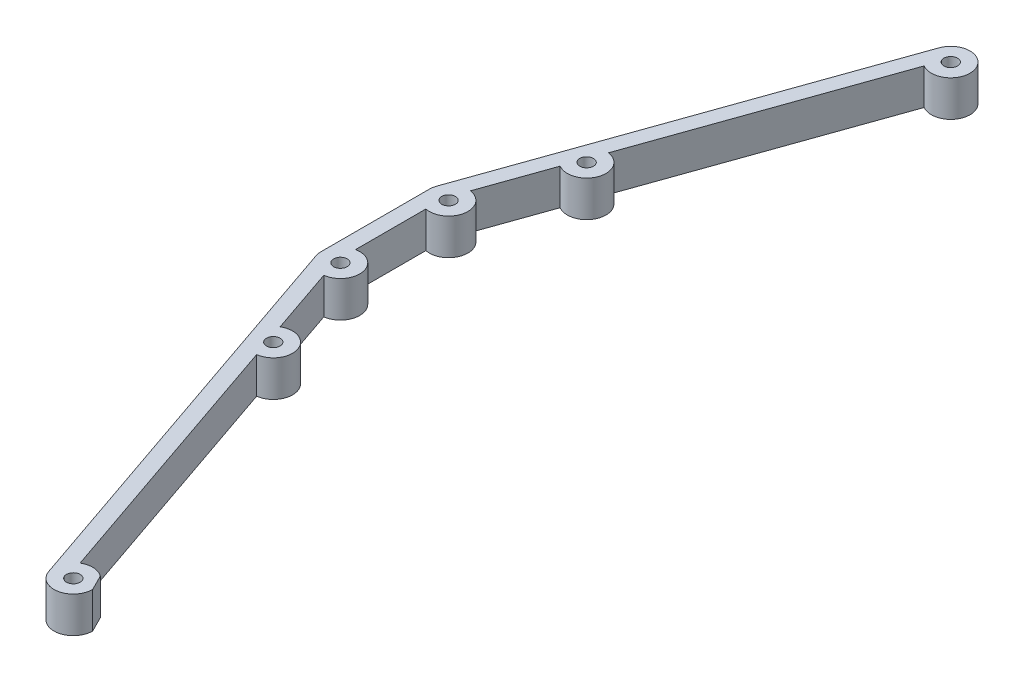
ISO-10303-21;
HEADER;
FILE_DESCRIPTION(('STEP AP214'),'2;1');
FILE_NAME('part.step','',(''),(''),'','','');
FILE_SCHEMA(('AUTOMOTIVE_DESIGN { 1 0 10303 214 1 1 1 1 }'));
ENDSEC;
DATA;
#1=APPLICATION_CONTEXT('core data for automotive mechanical design processes');
#2=APPLICATION_PROTOCOL_DEFINITION('international standard','automotive_design',2000,#1);
#3=PRODUCT_CONTEXT('',#1,'mechanical');
#4=PRODUCT('Part','Part','',(#3));
#5=PRODUCT_RELATED_PRODUCT_CATEGORY('part','',(#4));
#6=PRODUCT_DEFINITION_FORMATION('','',#4);
#7=PRODUCT_DEFINITION_CONTEXT('part definition',#1,'design');
#8=PRODUCT_DEFINITION('design','',#6,#7);
#9=PRODUCT_DEFINITION_SHAPE('','',#8);
#10=(LENGTH_UNIT() NAMED_UNIT(*) SI_UNIT(.MILLI.,.METRE.));
#11=(NAMED_UNIT(*) PLANE_ANGLE_UNIT() SI_UNIT($,.RADIAN.));
#12=(NAMED_UNIT(*) SI_UNIT($,.STERADIAN.) SOLID_ANGLE_UNIT());
#13=UNCERTAINTY_MEASURE_WITH_UNIT(LENGTH_MEASURE(1.E-05),#10,'distance_accuracy_value','');
#14=(GEOMETRIC_REPRESENTATION_CONTEXT(3) GLOBAL_UNCERTAINTY_ASSIGNED_CONTEXT((#13)) GLOBAL_UNIT_ASSIGNED_CONTEXT((#10,
#11,#12)) REPRESENTATION_CONTEXT('',''));
#15=CARTESIAN_POINT('',(0.,0.,0.));
#16=DIRECTION('',(0.,0.,1.));
#17=DIRECTION('',(1.,0.,0.));
#18=AXIS2_PLACEMENT_3D('',#15,#16,#17);
#19=CARTESIAN_POINT('',(18.1999631487136,14.,-41.2755472424004));
#20=DIRECTION('',(0.,-1.,0.));
#21=DIRECTION('',(0.,0.,-1.));
#22=AXIS2_PLACEMENT_3D('',#19,#20,#21);
#23=CYLINDRICAL_SURFACE('',#22,7.50000000000001);
#24=CARTESIAN_POINT('',(18.1999631487135,0.,-41.2755472424003));
#25=DIRECTION('',(0.,1.,0.));
#26=DIRECTION('',(0.,0.,1.));
#27=AXIS2_PLACEMENT_3D('',#24,#25,#26);
#28=CIRCLE('',#27,7.50000000000001);
#29=CARTESIAN_POINT('',(14.3327568592149,0.,-34.8494507978656));
#30=VERTEX_POINT('',#29);
#31=CARTESIAN_POINT('',(19.2392877627286,0.,-48.7031851136689));
#32=VERTEX_POINT('',#31);
#33=EDGE_CURVE('E316',#30,#32,#28,.T.);
#34=ORIENTED_EDGE('',*,*,#33,.T.);
#35=DIRECTION('',(0.,-1.,0.));
#36=VECTOR('',#35,1.);
#37=CARTESIAN_POINT('',(19.2392877627286,14.,-48.7031851136689));
#38=LINE('',#37,#36);
#39=CARTESIAN_POINT('',(19.2392877627286,14.,-48.7031851136689));
#40=VERTEX_POINT('',#39);
#41=EDGE_CURVE('E11',#40,#32,#38,.T.);
#42=ORIENTED_EDGE('',*,*,#41,.F.);
#43=CARTESIAN_POINT('',(18.1999631487136,14.,-41.2755472424004));
#44=DIRECTION('',(0.,1.,0.));
#45=DIRECTION('',(0.,0.,1.));
#46=AXIS2_PLACEMENT_3D('',#43,#44,#45);
#47=CIRCLE('',#46,7.50000000000001);
#48=CARTESIAN_POINT('',(14.3327568592149,14.,-34.8494507978657));
#49=VERTEX_POINT('',#48);
#50=EDGE_CURVE('E222',#49,#40,#47,.T.);
#51=ORIENTED_EDGE('',*,*,#50,.F.);
#52=DIRECTION('',(0.,-1.,0.));
#53=VECTOR('',#52,1.);
#54=CARTESIAN_POINT('',(14.3327568592149,14.,-34.8494507978657));
#55=LINE('',#54,#53);
#56=EDGE_CURVE('E241',#49,#30,#55,.T.);
#57=ORIENTED_EDGE('',*,*,#56,.T.);
#58=EDGE_LOOP('',(#34,#42,#51,#57));
#59=FACE_BOUND('',#58,.T.);
#60=ADVANCED_FACE('F40',(#59),#23,.T.);
#61=CARTESIAN_POINT('',(1.76842265814611,14.,0.626316358093404));
#62=DIRECTION('',(-0.942627225161207,0.,-0.333847142244594));
#63=DIRECTION('',(-0.333847142244594,0.,0.942627225161207));
#64=AXIS2_PLACEMENT_3D('',#61,#62,#63);
#65=PLANE('',#64);
#66=DIRECTION('',(0.333847142244594,0.,-0.942627225161207));
#67=VECTOR('',#66,1.);
#68=CARTESIAN_POINT('',(1.76842265814606,0.,0.626316358093404));
#69=LINE('',#68,#67);
#70=CARTESIAN_POINT('',(51.311176884942,0.,-139.259107341095));
#71=VERTEX_POINT('',#70);
#72=EDGE_CURVE('E306',#32,#71,#69,.T.);
#73=ORIENTED_EDGE('',*,*,#72,.T.);
#74=DIRECTION('',(0.,-1.,0.));
#75=VECTOR('',#74,1.);
#76=CARTESIAN_POINT('',(51.311176884942,14.,-139.259107341095));
#77=LINE('',#76,#75);
#78=CARTESIAN_POINT('',(51.311176884942,14.,-139.259107341095));
#79=VERTEX_POINT('',#78);
#80=EDGE_CURVE('E49',#79,#71,#77,.T.);
#81=ORIENTED_EDGE('',*,*,#80,.F.);
#82=DIRECTION('',(0.333847142244594,0.,-0.942627225161207));
#83=VECTOR('',#82,1.);
#84=CARTESIAN_POINT('',(1.76842265814611,14.,0.626316358093404));
#85=LINE('',#84,#83);
#86=EDGE_CURVE('E130',#40,#79,#85,.T.);
#87=ORIENTED_EDGE('',*,*,#86,.F.);
#88=ORIENTED_EDGE('',*,*,#41,.T.);
#89=EDGE_LOOP('',(#73,#81,#87,#88));
#90=FACE_BOUND('',#89,.T.);
#91=ADVANCED_FACE('F390',(#90),#65,.F.);
#92=CARTESIAN_POINT('',(55.1783831744406,14.,-145.68520378563));
#93=DIRECTION('',(0.,-1.,0.));
#94=DIRECTION('',(0.,0.,-1.));
#95=AXIS2_PLACEMENT_3D('',#92,#93,#94);
#96=CYLINDRICAL_SURFACE('',#95,7.50000000000001);
#97=CARTESIAN_POINT('',(55.1783831744406,0.,-145.68520378563));
#98=DIRECTION('',(0.,1.,0.));
#99=DIRECTION('',(0.,0.,1.));
#100=AXIS2_PLACEMENT_3D('',#97,#98,#99);
#101=CIRCLE('',#100,7.50000000000001);
#102=CARTESIAN_POINT('',(48.1086789857316,0.,-148.189057352464));
#103=VERTEX_POINT('',#102);
#104=EDGE_CURVE('E300',#71,#103,#101,.T.);
#105=ORIENTED_EDGE('',*,*,#104,.T.);
#106=DIRECTION('',(0.,-1.,0.));
#107=VECTOR('',#106,1.);
#108=CARTESIAN_POINT('',(48.1086789857316,14.,-148.189057352464));
#109=LINE('',#108,#107);
#110=CARTESIAN_POINT('',(48.1086789857316,14.,-148.189057352464));
#111=VERTEX_POINT('',#110);
#112=EDGE_CURVE('E289',#111,#103,#109,.T.);
#113=ORIENTED_EDGE('',*,*,#112,.F.);
#114=CARTESIAN_POINT('',(55.1783831744406,14.,-145.68520378563));
#115=DIRECTION('',(0.,1.,0.));
#116=DIRECTION('',(0.,0.,1.));
#117=AXIS2_PLACEMENT_3D('',#114,#115,#116);
#118=CIRCLE('',#117,7.50000000000001);
#119=EDGE_CURVE('E213',#79,#111,#118,.T.);
#120=ORIENTED_EDGE('',*,*,#119,.F.);
#121=ORIENTED_EDGE('',*,*,#80,.T.);
#122=EDGE_LOOP('',(#105,#113,#120,#121));
#123=FACE_BOUND('',#122,.T.);
#124=ADVANCED_FACE('F298',(#123),#96,.T.);
#125=CARTESIAN_POINT('',(-3.88734069282115,14.,-1.37676649537416));
#126=DIRECTION('',(0.942627225161207,0.,0.333847142244594));
#127=DIRECTION('',(0.333847142244594,0.,-0.942627225161207));
#128=AXIS2_PLACEMENT_3D('',#125,#126,#127);
#129=PLANE('',#128);
#130=DIRECTION('',(-0.333847142244594,0.,0.942627225161207));
#131=VECTOR('',#130,1.);
#132=CARTESIAN_POINT('',(-3.88734069282118,0.,-1.37676649537416));
#133=LINE('',#132,#131);
#134=CARTESIAN_POINT('',(-2.89132101426848,0.,-4.18905735246414));
#135=VERTEX_POINT('',#134);
#136=EDGE_CURVE('E308',#103,#135,#133,.T.);
#137=ORIENTED_EDGE('',*,*,#136,.T.);
#138=DIRECTION('',(0.,-1.,0.));
#139=VECTOR('',#138,1.);
#140=CARTESIAN_POINT('',(-2.89132101426848,14.,-4.18905735246411));
#141=LINE('',#140,#139);
#142=CARTESIAN_POINT('',(-2.89132101426848,14.,-4.18905735246411));
#143=VERTEX_POINT('',#142);
#144=EDGE_CURVE('E285',#143,#135,#141,.T.);
#145=ORIENTED_EDGE('',*,*,#144,.F.);
#146=DIRECTION('',(-0.333847142244594,0.,0.942627225161207));
#147=VECTOR('',#146,1.);
#148=CARTESIAN_POINT('',(-3.88734069282115,14.,-1.37676649537416));
#149=LINE('',#148,#147);
#150=EDGE_CURVE('E206',#111,#143,#149,.T.);
#151=ORIENTED_EDGE('',*,*,#150,.F.);
#152=ORIENTED_EDGE('',*,*,#112,.T.);
#153=EDGE_LOOP('',(#137,#145,#151,#152));
#154=FACE_BOUND('',#153,.T.);
#155=ADVANCED_FACE('F525',(#154),#129,.F.);
#156=CARTESIAN_POINT('',(4.17838317444061,14.,-1.68520378562964));
#157=DIRECTION('',(0.,-1.,0.));
#158=DIRECTION('',(0.,0.,-1.));
#159=AXIS2_PLACEMENT_3D('',#156,#157,#158);
#160=CYLINDRICAL_SURFACE('',#159,7.49999999999996);
#161=CARTESIAN_POINT('',(4.17838317444058,0.,-1.68520378562964));
#162=DIRECTION('',(0.,1.,0.));
#163=DIRECTION('',(0.,0.,1.));
#164=AXIS2_PLACEMENT_3D('',#161,#162,#163);
#165=CIRCLE('',#164,7.49999999999996);
#166=CARTESIAN_POINT('',(-3.3216168255594,0.,-1.68520378562964));
#167=VERTEX_POINT('',#166);
#168=EDGE_CURVE('E314',#135,#167,#165,.T.);
#169=ORIENTED_EDGE('',*,*,#168,.T.);
#170=DIRECTION('',(0.,-1.,0.));
#171=VECTOR('',#170,1.);
#172=CARTESIAN_POINT('',(-3.32161682555937,14.,-1.68520378562964));
#173=LINE('',#172,#171);
#174=CARTESIAN_POINT('',(-3.32161682555937,14.,-1.68520378562964));
#175=VERTEX_POINT('',#174);
#176=EDGE_CURVE('E281',#175,#167,#173,.T.);
#177=ORIENTED_EDGE('',*,*,#176,.F.);
#178=CARTESIAN_POINT('',(4.17838317444061,14.,-1.68520378562964));
#179=DIRECTION('',(0.,1.,0.));
#180=DIRECTION('',(0.,0.,1.));
#181=AXIS2_PLACEMENT_3D('',#178,#179,#180);
#182=CIRCLE('',#181,7.49999999999996);
#183=EDGE_CURVE('E197',#143,#175,#182,.T.);
#184=ORIENTED_EDGE('',*,*,#183,.F.);
#185=ORIENTED_EDGE('',*,*,#144,.T.);
#186=EDGE_LOOP('',(#169,#177,#184,#185));
#187=FACE_BOUND('',#186,.T.);
#188=ADVANCED_FACE('F523',(#187),#160,.T.);
#189=CARTESIAN_POINT('',(-3.32161682555943,14.,0.));
#190=DIRECTION('',(1.,0.,0.));
#191=DIRECTION('',(0.,0.,-1.));
#192=AXIS2_PLACEMENT_3D('',#189,#190,#191);
#193=PLANE('',#192);
#194=DIRECTION('',(0.,0.,1.));
#195=VECTOR('',#194,1.);
#196=CARTESIAN_POINT('',(-3.32161682555943,0.,0.));
#197=LINE('',#196,#195);
#198=CARTESIAN_POINT('',(-3.32161682555943,0.,40.3147962143704));
#199=VERTEX_POINT('',#198);
#200=EDGE_CURVE('E322',#167,#199,#197,.T.);
#201=ORIENTED_EDGE('',*,*,#200,.T.);
#202=DIRECTION('',(0.,-1.,0.));
#203=VECTOR('',#202,1.);
#204=CARTESIAN_POINT('',(-3.32161682555937,14.,40.3147962143704));
#205=LINE('',#204,#203);
#206=CARTESIAN_POINT('',(-3.32161682555937,14.,40.3147962143704));
#207=VERTEX_POINT('',#206);
#208=EDGE_CURVE('E277',#207,#199,#205,.T.);
#209=ORIENTED_EDGE('',*,*,#208,.F.);
#210=DIRECTION('',(0.,0.,1.));
#211=VECTOR('',#210,1.);
#212=CARTESIAN_POINT('',(-3.32161682555943,14.,0.));
#213=LINE('',#212,#211);
#214=EDGE_CURVE('E205',#175,#207,#213,.T.);
#215=ORIENTED_EDGE('',*,*,#214,.F.);
#216=ORIENTED_EDGE('',*,*,#176,.T.);
#217=EDGE_LOOP('',(#201,#209,#215,#216));
#218=FACE_BOUND('',#217,.T.);
#219=ADVANCED_FACE('F521',(#218),#193,.F.);
#220=CARTESIAN_POINT('',(4.17838317444061,14.,40.3147962143704));
#221=DIRECTION('',(0.,-1.,0.));
#222=DIRECTION('',(0.,0.,-1.));
#223=AXIS2_PLACEMENT_3D('',#220,#221,#222);
#224=CYLINDRICAL_SURFACE('',#223,7.49999999999999);
#225=CARTESIAN_POINT('',(4.17838317444058,0.,40.3147962143704));
#226=DIRECTION('',(0.,1.,0.));
#227=DIRECTION('',(0.,0.,1.));
#228=AXIS2_PLACEMENT_3D('',#225,#226,#227);
#229=CIRCLE('',#228,7.49999999999999);
#230=CARTESIAN_POINT('',(-2.91512850012948,0.,42.7503848747845));
#231=VERTEX_POINT('',#230);
#232=EDGE_CURVE('E325',#199,#231,#229,.T.);
#233=ORIENTED_EDGE('',*,*,#232,.T.);
#234=DIRECTION('',(0.,-1.,0.));
#235=VECTOR('',#234,1.);
#236=CARTESIAN_POINT('',(-2.91512850012948,14.,42.7503848747845));
#237=LINE('',#236,#235);
#238=CARTESIAN_POINT('',(-2.91512850012948,14.,42.7503848747845));
#239=VERTEX_POINT('',#238);
#240=EDGE_CURVE('E273',#239,#231,#237,.T.);
#241=ORIENTED_EDGE('',*,*,#240,.F.);
#242=CARTESIAN_POINT('',(4.17838317444061,14.,40.3147962143704));
#243=DIRECTION('',(0.,1.,0.));
#244=DIRECTION('',(0.,0.,1.));
#245=AXIS2_PLACEMENT_3D('',#242,#243,#244);
#246=CIRCLE('',#245,7.49999999999999);
#247=EDGE_CURVE('E212',#207,#239,#246,.T.);
#248=ORIENTED_EDGE('',*,*,#247,.F.);
#249=ORIENTED_EDGE('',*,*,#208,.T.);
#250=EDGE_LOOP('',(#233,#241,#248,#249));
#251=FACE_BOUND('',#250,.T.);
#252=ADVANCED_FACE('F517',(#251),#224,.T.);
#253=CARTESIAN_POINT('',(-15.738245178311,14.,5.40379620837578));
#254=DIRECTION('',(0.945801556609346,0.,-0.32474515472188));
#255=DIRECTION('',(-0.32474515472188,0.,-0.945801556609346));
#256=AXIS2_PLACEMENT_3D('',#253,#254,#255);
#257=PLANE('',#256);
#258=DIRECTION('',(0.32474515472188,0.,0.945801556609346));
#259=VECTOR('',#258,1.);
#260=CARTESIAN_POINT('',(-15.738245178311,0.,5.40379620837578));
#261=LINE('',#260,#259);
#262=CARTESIAN_POINT('',(51.3348714998705,0.,200.750384874784));
#263=VERTEX_POINT('',#262);
#264=EDGE_CURVE('E328',#231,#263,#261,.T.);
#265=ORIENTED_EDGE('',*,*,#264,.T.);
#266=DIRECTION('',(0.,-1.,0.));
#267=VECTOR('',#266,1.);
#268=CARTESIAN_POINT('',(51.3348714998705,14.,200.750384874784));
#269=LINE('',#268,#267);
#270=CARTESIAN_POINT('',(51.3348714998705,14.,200.750384874784));
#271=VERTEX_POINT('',#270);
#272=EDGE_CURVE('E269',#271,#263,#269,.T.);
#273=ORIENTED_EDGE('',*,*,#272,.F.);
#274=DIRECTION('',(0.32474515472188,0.,0.945801556609346));
#275=VECTOR('',#274,1.);
#276=CARTESIAN_POINT('',(-15.738245178311,14.,5.40379620837578));
#277=LINE('',#276,#275);
#278=EDGE_CURVE('E438',#239,#271,#277,.T.);
#279=ORIENTED_EDGE('',*,*,#278,.F.);
#280=ORIENTED_EDGE('',*,*,#240,.T.);
#281=EDGE_LOOP('',(#265,#273,#279,#280));
#282=FACE_BOUND('',#281,.T.);
#283=ADVANCED_FACE('F514',(#282),#257,.F.);
#284=CARTESIAN_POINT('',(58.4283831744406,14.,198.31479621437));
#285=DIRECTION('',(0.,-1.,0.));
#286=DIRECTION('',(0.,0.,-1.));
#287=AXIS2_PLACEMENT_3D('',#284,#285,#286);
#288=CYLINDRICAL_SURFACE('',#287,7.50000000000001);
#289=CARTESIAN_POINT('',(58.4283831744406,0.,198.31479621437));
#290=DIRECTION('',(0.,1.,0.));
#291=DIRECTION('',(0.,0.,1.));
#292=AXIS2_PLACEMENT_3D('',#289,#290,#291);
#293=CIRCLE('',#292,7.50000000000001);
#294=CARTESIAN_POINT('',(65.9282114546092,0.,198.264044189932));
#295=VERTEX_POINT('',#294);
#296=EDGE_CURVE('E332',#263,#295,#293,.T.);
#297=ORIENTED_EDGE('',*,*,#296,.T.);
#298=DIRECTION('',(0.,-1.,0.));
#299=VECTOR('',#298,1.);
#300=CARTESIAN_POINT('',(65.9282114546092,14.,198.264044189932));
#301=LINE('',#300,#299);
#302=CARTESIAN_POINT('',(65.9282114546092,14.,198.264044189932));
#303=VERTEX_POINT('',#302);
#304=EDGE_CURVE('E266',#303,#295,#301,.T.);
#305=ORIENTED_EDGE('',*,*,#304,.F.);
#306=CARTESIAN_POINT('',(58.4283831744406,14.,198.31479621437));
#307=DIRECTION('',(0.,1.,0.));
#308=DIRECTION('',(0.,0.,1.));
#309=AXIS2_PLACEMENT_3D('',#306,#307,#308);
#310=CIRCLE('',#309,7.50000000000001);
#311=EDGE_CURVE('E435',#271,#303,#310,.T.);
#312=ORIENTED_EDGE('',*,*,#311,.F.);
#313=ORIENTED_EDGE('',*,*,#272,.T.);
#314=EDGE_LOOP('',(#297,#305,#312,#313));
#315=FACE_BOUND('',#314,.T.);
#316=ADVANCED_FACE('F508',(#315),#288,.T.);
#317=CARTESIAN_POINT('',(-27.1426304551521,14.,13.686306365444));
#318=DIRECTION('',(0.892908929605929,0.,-0.450237319010756));
#319=DIRECTION('',(-0.450237319010756,0.,-0.892908929605929));
#320=AXIS2_PLACEMENT_3D('',#317,#318,#319);
#321=PLANE('',#320);
#322=DIRECTION('',(0.450237319010756,0.,0.892908929605929));
#323=VECTOR('',#322,1.);
#324=CARTESIAN_POINT('',(-27.1426304551521,0.,13.686306365444));
#325=LINE('',#324,#323);
#326=CARTESIAN_POINT('',(62.9283831744407,0.,192.31479621437));
#327=VERTEX_POINT('',#326);
#328=EDGE_CURVE('E336',#327,#295,#325,.T.);
#329=ORIENTED_EDGE('',*,*,#328,.F.);
#330=DIRECTION('',(0.,-1.,0.));
#331=VECTOR('',#330,1.);
#332=CARTESIAN_POINT('',(62.9283831744407,14.,192.31479621437));
#333=LINE('',#332,#331);
#334=CARTESIAN_POINT('',(62.9283831744407,14.,192.31479621437));
#335=VERTEX_POINT('',#334);
#336=EDGE_CURVE('E263',#335,#327,#333,.T.);
#337=ORIENTED_EDGE('',*,*,#336,.F.);
#338=DIRECTION('',(0.450237319010756,0.,0.892908929605929));
#339=VECTOR('',#338,1.);
#340=CARTESIAN_POINT('',(-27.1426304551521,14.,13.686306365444));
#341=LINE('',#340,#339);
#342=EDGE_CURVE('E431',#335,#303,#341,.T.);
#343=ORIENTED_EDGE('',*,*,#342,.T.);
#344=ORIENTED_EDGE('',*,*,#304,.T.);
#345=EDGE_LOOP('',(#329,#337,#343,#344));
#346=FACE_BOUND('',#345,.T.);
#347=ADVANCED_FACE('F504',(#346),#321,.T.);
#348=CARTESIAN_POINT('',(54.6233010629972,0.,191.851720311584));
#349=VERTEX_POINT('',#348);
#350=EDGE_CURVE('E337',#327,#349,#293,.T.);
#351=ORIENTED_EDGE('',*,*,#350,.T.);
#352=DIRECTION('',(0.,-1.,0.));
#353=VECTOR('',#352,1.);
#354=CARTESIAN_POINT('',(54.6233010629973,14.,191.851720311584));
#355=LINE('',#354,#353);
#356=CARTESIAN_POINT('',(54.6233010629973,14.,191.851720311584));
#357=VERTEX_POINT('',#356);
#358=EDGE_CURVE('E260',#357,#349,#355,.T.);
#359=ORIENTED_EDGE('',*,*,#358,.F.);
#360=EDGE_CURVE('E430',#335,#357,#310,.T.);
#361=ORIENTED_EDGE('',*,*,#360,.F.);
#362=ORIENTED_EDGE('',*,*,#336,.T.);
#363=EDGE_LOOP('',(#351,#359,#361,#362));
#364=FACE_BOUND('',#363,.T.);
#365=ADVANCED_FACE('F462',(#364),#288,.T.);
#366=CARTESIAN_POINT('',(-10.0634358386549,14.,3.45532528004452));
#367=DIRECTION('',(0.945801556609346,0.,-0.32474515472188));
#368=DIRECTION('',(-0.32474515472188,0.,-0.945801556609346));
#369=AXIS2_PLACEMENT_3D('',#366,#367,#368);
#370=PLANE('',#369);
#371=DIRECTION('',(0.32474515472188,0.,0.945801556609346));
#372=VECTOR('',#371,1.);
#373=CARTESIAN_POINT('',(-10.0634358386549,0.,3.45532528004452));
#374=LINE('',#373,#372);
#375=CARTESIAN_POINT('',(18.7853571143748,0.,87.4757729589146));
#376=VERTEX_POINT('',#375);
#377=EDGE_CURVE('E341',#376,#349,#374,.T.);
#378=ORIENTED_EDGE('',*,*,#377,.F.);
#379=DIRECTION('',(0.,-1.,0.));
#380=VECTOR('',#379,1.);
#381=CARTESIAN_POINT('',(18.7853571143748,14.,87.4757729589146));
#382=LINE('',#381,#380);
#383=CARTESIAN_POINT('',(18.7853571143748,14.,87.4757729589146));
#384=VERTEX_POINT('',#383);
#385=EDGE_CURVE('E257',#384,#376,#382,.T.);
#386=ORIENTED_EDGE('',*,*,#385,.F.);
#387=DIRECTION('',(0.32474515472188,0.,0.945801556609346));
#388=VECTOR('',#387,1.);
#389=CARTESIAN_POINT('',(-10.0634358386549,14.,3.45532528004452));
#390=LINE('',#389,#388);
#391=EDGE_CURVE('E426',#384,#357,#390,.T.);
#392=ORIENTED_EDGE('',*,*,#391,.T.);
#393=ORIENTED_EDGE('',*,*,#358,.T.);
#394=EDGE_LOOP('',(#378,#386,#392,#393));
#395=FACE_BOUND('',#394,.T.);
#396=ADVANCED_FACE('F466',(#395),#370,.T.);
#397=CARTESIAN_POINT('',(17.8176796727596,14.,80.0384615919629));
#398=DIRECTION('',(0.,-1.,0.));
#399=DIRECTION('',(0.,0.,-1.));
#400=AXIS2_PLACEMENT_3D('',#397,#398,#399);
#401=CYLINDRICAL_SURFACE('',#400,7.50000000000002);
#402=CARTESIAN_POINT('',(17.8176796727595,0.,80.0384615919629));
#403=DIRECTION('',(0.,1.,0.));
#404=DIRECTION('',(0.,0.,1.));
#405=AXIS2_PLACEMENT_3D('',#402,#403,#404);
#406=CIRCLE('',#405,7.50000000000002);
#407=CARTESIAN_POINT('',(14.0125975613161,0.,73.5753856891769));
#408=VERTEX_POINT('',#407);
#409=EDGE_CURVE('E345',#376,#408,#406,.T.);
#410=ORIENTED_EDGE('',*,*,#409,.T.);
#411=DIRECTION('',(0.,-1.,0.));
#412=VECTOR('',#411,1.);
#413=CARTESIAN_POINT('',(14.0125975613161,14.,73.5753856891769));
#414=LINE('',#413,#412);
#415=CARTESIAN_POINT('',(14.0125975613161,14.,73.5753856891769));
#416=VERTEX_POINT('',#415);
#417=EDGE_CURVE('E253',#416,#408,#414,.T.);
#418=ORIENTED_EDGE('',*,*,#417,.F.);
#419=CARTESIAN_POINT('',(17.8176796727596,14.,80.0384615919629));
#420=DIRECTION('',(0.,1.,0.));
#421=DIRECTION('',(0.,0.,1.));
#422=AXIS2_PLACEMENT_3D('',#419,#420,#421);
#423=CIRCLE('',#422,7.50000000000002);
#424=EDGE_CURVE('E423',#384,#416,#423,.T.);
#425=ORIENTED_EDGE('',*,*,#424,.F.);
#426=ORIENTED_EDGE('',*,*,#385,.T.);
#427=EDGE_LOOP('',(#410,#418,#425,#426));
#428=FACE_BOUND('',#427,.T.);
#429=ADVANCED_FACE('F471',(#428),#401,.T.);
#430=CARTESIAN_POINT('',(-10.0634358386549,14.,3.45532528004452));
#431=DIRECTION('',(-0.945801556609346,0.,0.32474515472188));
#432=DIRECTION('',(0.32474515472188,0.,0.945801556609346));
#433=AXIS2_PLACEMENT_3D('',#430,#431,#432);
#434=PLANE('',#433);
#435=DIRECTION('',(-0.32474515472188,0.,-0.945801556609346));
#436=VECTOR('',#435,1.);
#437=CARTESIAN_POINT('',(-10.0634358386549,0.,3.45532528004452));
#438=LINE('',#437,#436);
#439=CARTESIAN_POINT('',(5.14606061605585,0.,47.7521075813221));
#440=VERTEX_POINT('',#439);
#441=EDGE_CURVE('E348',#408,#440,#438,.T.);
#442=ORIENTED_EDGE('',*,*,#441,.T.);
#443=DIRECTION('',(0.,-1.,0.));
#444=VECTOR('',#443,1.);
#445=CARTESIAN_POINT('',(5.14606061605588,14.,47.7521075813221));
#446=LINE('',#445,#444);
#447=CARTESIAN_POINT('',(5.14606061605588,14.,47.7521075813221));
#448=VERTEX_POINT('',#447);
#449=EDGE_CURVE('E249',#448,#440,#446,.T.);
#450=ORIENTED_EDGE('',*,*,#449,.F.);
#451=DIRECTION('',(-0.32474515472188,0.,-0.945801556609346));
#452=VECTOR('',#451,1.);
#453=CARTESIAN_POINT('',(-10.0634358386549,14.,3.45532528004452));
#454=LINE('',#453,#452);
#455=EDGE_CURVE('E420',#416,#448,#454,.T.);
#456=ORIENTED_EDGE('',*,*,#455,.F.);
#457=ORIENTED_EDGE('',*,*,#417,.T.);
#458=EDGE_LOOP('',(#442,#450,#456,#457));
#459=FACE_BOUND('',#458,.T.);
#460=ADVANCED_FACE('F475',(#459),#434,.F.);
#461=CARTESIAN_POINT('',(2.67838317444064,0.,32.9663269860209));
#462=VERTEX_POINT('',#461);
#463=EDGE_CURVE('E329',#440,#462,#229,.T.);
#464=ORIENTED_EDGE('',*,*,#463,.T.);
#465=DIRECTION('',(0.,-1.,0.));
#466=VECTOR('',#465,1.);
#467=CARTESIAN_POINT('',(2.67838317444064,14.,32.9663269860209));
#468=LINE('',#467,#466);
#469=CARTESIAN_POINT('',(2.67838317444064,14.,32.9663269860209));
#470=VERTEX_POINT('',#469);
#471=EDGE_CURVE('E191',#470,#462,#468,.T.);
#472=ORIENTED_EDGE('',*,*,#471,.F.);
#473=EDGE_CURVE('E180',#448,#470,#246,.T.);
#474=ORIENTED_EDGE('',*,*,#473,.F.);
#475=ORIENTED_EDGE('',*,*,#449,.T.);
#476=EDGE_LOOP('',(#464,#472,#474,#475));
#477=FACE_BOUND('',#476,.T.);
#478=ADVANCED_FACE('F479',(#477),#224,.T.);
#479=CARTESIAN_POINT('',(2.67838317444058,14.,0.));
#480=DIRECTION('',(-1.,0.,0.));
#481=DIRECTION('',(0.,0.,1.));
#482=AXIS2_PLACEMENT_3D('',#479,#480,#481);
#483=PLANE('',#482);
#484=DIRECTION('',(0.,0.,-1.));
#485=VECTOR('',#484,1.);
#486=CARTESIAN_POINT('',(2.67838317444058,0.,0.));
#487=LINE('',#486,#485);
#488=CARTESIAN_POINT('',(2.67838317444064,0.,5.66326544271986));
#489=VERTEX_POINT('',#488);
#490=EDGE_CURVE('E189',#462,#489,#487,.T.);
#491=ORIENTED_EDGE('',*,*,#490,.T.);
#492=DIRECTION('',(0.,-1.,0.));
#493=VECTOR('',#492,1.);
#494=CARTESIAN_POINT('',(2.67838317444064,14.,5.66326544271986));
#495=LINE('',#494,#493);
#496=CARTESIAN_POINT('',(2.67838317444064,14.,5.66326544271986));
#497=VERTEX_POINT('',#496);
#498=EDGE_CURVE('E186',#497,#489,#495,.T.);
#499=ORIENTED_EDGE('',*,*,#498,.F.);
#500=DIRECTION('',(0.,0.,-1.));
#501=VECTOR('',#500,1.);
#502=CARTESIAN_POINT('',(2.67838317444058,14.,0.));
#503=LINE('',#502,#501);
#504=EDGE_CURVE('E173',#470,#497,#503,.T.);
#505=ORIENTED_EDGE('',*,*,#504,.F.);
#506=ORIENTED_EDGE('',*,*,#471,.T.);
#507=EDGE_LOOP('',(#491,#499,#505,#506));
#508=FACE_BOUND('',#507,.T.);
#509=ADVANCED_FACE('F187',(#508),#483,.F.);
#510=CARTESIAN_POINT('',(5.21770778845557,0.,-9.11284165689819));
#511=VERTEX_POINT('',#510);
#512=EDGE_CURVE('E116',#489,#511,#165,.T.);
#513=ORIENTED_EDGE('',*,*,#512,.T.);
#514=DIRECTION('',(0.,-1.,0.));
#515=VECTOR('',#514,1.);
#516=CARTESIAN_POINT('',(5.21770778845559,14.,-9.11284165689819));
#517=LINE('',#516,#515);
#518=CARTESIAN_POINT('',(5.21770778845559,14.,-9.11284165689819));
#519=VERTEX_POINT('',#518);
#520=EDGE_CURVE('E192',#519,#511,#517,.T.);
#521=ORIENTED_EDGE('',*,*,#520,.F.);
#522=EDGE_CURVE('E178',#497,#519,#182,.T.);
#523=ORIENTED_EDGE('',*,*,#522,.F.);
#524=ORIENTED_EDGE('',*,*,#498,.T.);
#525=EDGE_LOOP('',(#513,#521,#523,#524));
#526=FACE_BOUND('',#525,.T.);
#527=ADVANCED_FACE('F194',(#526),#160,.T.);
#528=CARTESIAN_POINT('',(4.17838317444061,14.,-1.68520378562964));
#529=DIRECTION('',(0.,-1.,0.));
#530=DIRECTION('',(0.,0.,-1.));
#531=AXIS2_PLACEMENT_3D('',#528,#529,#530);
#532=CYLINDRICAL_SURFACE('',#531,2.65);
#533=CARTESIAN_POINT('',(4.17838317444061,14.,-1.68520378562964));
#534=DIRECTION('',(0.,1.,0.));
#535=DIRECTION('',(0.,0.,1.));
#536=AXIS2_PLACEMENT_3D('',#533,#534,#535);
#537=CIRCLE('',#536,2.65);
#538=CARTESIAN_POINT('',(4.17838317444061,14.,0.964796214370359));
#539=VERTEX_POINT('',#538);
#540=EDGE_CURVE('E402',#539,#539,#537,.T.);
#541=ORIENTED_EDGE('',*,*,#540,.T.);
#542=EDGE_LOOP('',(#541));
#543=FACE_BOUND('',#542,.T.);
#544=CARTESIAN_POINT('',(4.17838317444058,0.,-1.68520378562964));
#545=DIRECTION('',(0.,1.,0.));
#546=DIRECTION('',(0.,0.,1.));
#547=AXIS2_PLACEMENT_3D('',#544,#545,#546);
#548=CIRCLE('',#547,2.65);
#549=CARTESIAN_POINT('',(4.17838317444058,0.,0.964796214370359));
#550=VERTEX_POINT('',#549);
#551=EDGE_CURVE('E230',#550,#550,#548,.T.);
#552=ORIENTED_EDGE('',*,*,#551,.F.);
#553=EDGE_LOOP('',(#552));
#554=FACE_BOUND('',#553,.T.);
#555=ADVANCED_FACE('F376',(#543,#554),#532,.F.);
#556=CARTESIAN_POINT('',(4.17838317444061,14.,40.3147962143704));
#557=DIRECTION('',(0.,-1.,0.));
#558=DIRECTION('',(0.,0.,-1.));
#559=AXIS2_PLACEMENT_3D('',#556,#557,#558);
#560=CYLINDRICAL_SURFACE('',#559,2.65);
#561=CARTESIAN_POINT('',(4.17838317444061,14.,40.3147962143704));
#562=DIRECTION('',(0.,1.,0.));
#563=DIRECTION('',(0.,0.,1.));
#564=AXIS2_PLACEMENT_3D('',#561,#562,#563);
#565=CIRCLE('',#564,2.65);
#566=CARTESIAN_POINT('',(4.17838317444061,14.,42.9647962143704));
#567=VERTEX_POINT('',#566);
#568=EDGE_CURVE('E406',#567,#567,#565,.T.);
#569=ORIENTED_EDGE('',*,*,#568,.T.);
#570=EDGE_LOOP('',(#569));
#571=FACE_BOUND('',#570,.T.);
#572=CARTESIAN_POINT('',(4.17838317444058,0.,40.3147962143704));
#573=DIRECTION('',(0.,1.,0.));
#574=DIRECTION('',(0.,0.,1.));
#575=AXIS2_PLACEMENT_3D('',#572,#573,#574);
#576=CIRCLE('',#575,2.65);
#577=CARTESIAN_POINT('',(4.17838317444058,0.,42.9647962143704));
#578=VERTEX_POINT('',#577);
#579=EDGE_CURVE('E237',#578,#578,#576,.T.);
#580=ORIENTED_EDGE('',*,*,#579,.F.);
#581=EDGE_LOOP('',(#580));
#582=FACE_BOUND('',#581,.T.);
#583=ADVANCED_FACE('F373',(#571,#582),#560,.F.);
#584=CARTESIAN_POINT('',(17.8176796727596,14.,80.0384615919629));
#585=DIRECTION('',(0.,-1.,0.));
#586=DIRECTION('',(0.,0.,-1.));
#587=AXIS2_PLACEMENT_3D('',#584,#585,#586);
#588=CYLINDRICAL_SURFACE('',#587,2.65);
#589=CARTESIAN_POINT('',(17.8176796727596,14.,80.0384615919629));
#590=DIRECTION('',(0.,1.,0.));
#591=DIRECTION('',(0.,0.,1.));
#592=AXIS2_PLACEMENT_3D('',#589,#590,#591);
#593=CIRCLE('',#592,2.65);
#594=CARTESIAN_POINT('',(17.8176796727596,14.,82.6884615919629));
#595=VERTEX_POINT('',#594);
#596=EDGE_CURVE('E409',#595,#595,#593,.T.);
#597=ORIENTED_EDGE('',*,*,#596,.T.);
#598=EDGE_LOOP('',(#597));
#599=FACE_BOUND('',#598,.T.);
#600=CARTESIAN_POINT('',(17.8176796727595,0.,80.0384615919629));
#601=DIRECTION('',(0.,1.,0.));
#602=DIRECTION('',(0.,0.,1.));
#603=AXIS2_PLACEMENT_3D('',#600,#601,#602);
#604=CIRCLE('',#603,2.65);
#605=CARTESIAN_POINT('',(17.8176796727595,0.,82.6884615919629));
#606=VERTEX_POINT('',#605);
#607=EDGE_CURVE('E363',#606,#606,#604,.T.);
#608=ORIENTED_EDGE('',*,*,#607,.F.);
#609=EDGE_LOOP('',(#608));
#610=FACE_BOUND('',#609,.T.);
#611=ADVANCED_FACE('F375',(#599,#610),#588,.F.);
#612=CARTESIAN_POINT('',(58.4283831744406,14.,198.31479621437));
#613=DIRECTION('',(0.,-1.,0.));
#614=DIRECTION('',(0.,0.,-1.));
#615=AXIS2_PLACEMENT_3D('',#612,#613,#614);
#616=CYLINDRICAL_SURFACE('',#615,2.65);
#617=CARTESIAN_POINT('',(58.4283831744406,14.,198.31479621437));
#618=DIRECTION('',(0.,1.,0.));
#619=DIRECTION('',(0.,0.,1.));
#620=AXIS2_PLACEMENT_3D('',#617,#618,#619);
#621=CIRCLE('',#620,2.65);
#622=CARTESIAN_POINT('',(58.4283831744406,14.,200.96479621437));
#623=VERTEX_POINT('',#622);
#624=EDGE_CURVE('E413',#623,#623,#621,.T.);
#625=ORIENTED_EDGE('',*,*,#624,.T.);
#626=EDGE_LOOP('',(#625));
#627=FACE_BOUND('',#626,.T.);
#628=CARTESIAN_POINT('',(58.4283831744406,0.,198.31479621437));
#629=DIRECTION('',(0.,1.,0.));
#630=DIRECTION('',(0.,0.,1.));
#631=AXIS2_PLACEMENT_3D('',#628,#629,#630);
#632=CIRCLE('',#631,2.65);
#633=CARTESIAN_POINT('',(58.4283831744406,0.,200.96479621437));
#634=VERTEX_POINT('',#633);
#635=EDGE_CURVE('E359',#634,#634,#632,.T.);
#636=ORIENTED_EDGE('',*,*,#635,.F.);
#637=EDGE_LOOP('',(#636));
#638=FACE_BOUND('',#637,.T.);
#639=ADVANCED_FACE('F383',(#627,#638),#616,.F.);
#640=CARTESIAN_POINT('',(18.1999631487136,14.,-41.2755472424004));
#641=DIRECTION('',(0.,-1.,0.));
#642=DIRECTION('',(0.,0.,-1.));
#643=AXIS2_PLACEMENT_3D('',#640,#641,#642);
#644=CYLINDRICAL_SURFACE('',#643,2.65);
#645=CARTESIAN_POINT('',(18.1999631487136,14.,-41.2755472424004));
#646=DIRECTION('',(0.,1.,0.));
#647=DIRECTION('',(0.,0.,1.));
#648=AXIS2_PLACEMENT_3D('',#645,#646,#647);
#649=CIRCLE('',#648,2.65);
#650=CARTESIAN_POINT('',(18.1999631487136,14.,-38.6255472424004));
#651=VERTEX_POINT('',#650);
#652=EDGE_CURVE('E200',#651,#651,#649,.T.);
#653=ORIENTED_EDGE('',*,*,#652,.T.);
#654=EDGE_LOOP('',(#653));
#655=FACE_BOUND('',#654,.T.);
#656=CARTESIAN_POINT('',(18.1999631487135,0.,-41.2755472424003));
#657=DIRECTION('',(0.,1.,0.));
#658=DIRECTION('',(0.,0.,1.));
#659=AXIS2_PLACEMENT_3D('',#656,#657,#658);
#660=CIRCLE('',#659,2.65);
#661=CARTESIAN_POINT('',(18.1999631487135,0.,-38.6255472424003));
#662=VERTEX_POINT('',#661);
#663=EDGE_CURVE('E355',#662,#662,#660,.T.);
#664=ORIENTED_EDGE('',*,*,#663,.F.);
#665=EDGE_LOOP('',(#664));
#666=FACE_BOUND('',#665,.T.);
#667=ADVANCED_FACE('F558',(#655,#666),#644,.F.);
#668=CARTESIAN_POINT('',(1.76842265814611,14.,0.626316358093404));
#669=DIRECTION('',(-0.942627225161207,0.,-0.333847142244594));
#670=DIRECTION('',(-0.333847142244594,0.,0.942627225161207));
#671=AXIS2_PLACEMENT_3D('',#668,#669,#670);
#672=PLANE('',#671);
#673=DIRECTION('',(0.333847142244594,0.,-0.942627225161207));
#674=VECTOR('',#673,1.);
#675=CARTESIAN_POINT('',(1.76842265814606,0.,0.626316358093404));
#676=LINE('',#675,#674);
#677=EDGE_CURVE('E122',#511,#30,#676,.T.);
#678=ORIENTED_EDGE('',*,*,#677,.T.);
#679=ORIENTED_EDGE('',*,*,#56,.F.);
#680=DIRECTION('',(0.333847142244594,0.,-0.942627225161207));
#681=VECTOR('',#680,1.);
#682=CARTESIAN_POINT('',(1.76842265814611,14.,0.626316358093404));
#683=LINE('',#682,#681);
#684=EDGE_CURVE('E57',#519,#49,#683,.T.);
#685=ORIENTED_EDGE('',*,*,#684,.F.);
#686=ORIENTED_EDGE('',*,*,#520,.T.);
#687=EDGE_LOOP('',(#678,#679,#685,#686));
#688=FACE_BOUND('',#687,.T.);
#689=ADVANCED_FACE('F554',(#688),#672,.F.);
#690=CARTESIAN_POINT('',(55.1783831744406,14.,-145.68520378563));
#691=DIRECTION('',(0.,-1.,0.));
#692=DIRECTION('',(0.,0.,-1.));
#693=AXIS2_PLACEMENT_3D('',#690,#691,#692);
#694=CYLINDRICAL_SURFACE('',#693,2.65);
#695=CARTESIAN_POINT('',(55.1783831744406,14.,-145.68520378563));
#696=DIRECTION('',(0.,1.,0.));
#697=DIRECTION('',(0.,0.,1.));
#698=AXIS2_PLACEMENT_3D('',#695,#696,#697);
#699=CIRCLE('',#698,2.65);
#700=CARTESIAN_POINT('',(55.1783831744406,14.,-143.03520378563));
#701=VERTEX_POINT('',#700);
#702=EDGE_CURVE('E244',#701,#701,#699,.T.);
#703=ORIENTED_EDGE('',*,*,#702,.T.);
#704=EDGE_LOOP('',(#703));
#705=FACE_BOUND('',#704,.T.);
#706=CARTESIAN_POINT('',(55.1783831744406,0.,-145.68520378563));
#707=DIRECTION('',(0.,1.,0.));
#708=DIRECTION('',(0.,0.,1.));
#709=AXIS2_PLACEMENT_3D('',#706,#707,#708);
#710=CIRCLE('',#709,2.65);
#711=CARTESIAN_POINT('',(55.1783831744406,0.,-143.03520378563));
#712=VERTEX_POINT('',#711);
#713=EDGE_CURVE('E224',#712,#712,#710,.T.);
#714=ORIENTED_EDGE('',*,*,#713,.F.);
#715=EDGE_LOOP('',(#714));
#716=FACE_BOUND('',#715,.T.);
#717=ADVANCED_FACE('F557',(#705,#716),#694,.F.);
#718=CARTESIAN_POINT('',(0.,14.,0.));
#719=DIRECTION('',(0.,1.,0.));
#720=DIRECTION('',(0.,0.,1.));
#721=AXIS2_PLACEMENT_3D('',#718,#719,#720);
#722=PLANE('',#721);
#723=ORIENTED_EDGE('',*,*,#50,.T.);
#724=ORIENTED_EDGE('',*,*,#86,.T.);
#725=ORIENTED_EDGE('',*,*,#119,.T.);
#726=ORIENTED_EDGE('',*,*,#150,.T.);
#727=ORIENTED_EDGE('',*,*,#183,.T.);
#728=ORIENTED_EDGE('',*,*,#214,.T.);
#729=ORIENTED_EDGE('',*,*,#247,.T.);
#730=ORIENTED_EDGE('',*,*,#278,.T.);
#731=ORIENTED_EDGE('',*,*,#311,.T.);
#732=ORIENTED_EDGE('',*,*,#342,.F.);
#733=ORIENTED_EDGE('',*,*,#360,.T.);
#734=ORIENTED_EDGE('',*,*,#391,.F.);
#735=ORIENTED_EDGE('',*,*,#424,.T.);
#736=ORIENTED_EDGE('',*,*,#455,.T.);
#737=ORIENTED_EDGE('',*,*,#473,.T.);
#738=ORIENTED_EDGE('',*,*,#504,.T.);
#739=ORIENTED_EDGE('',*,*,#522,.T.);
#740=ORIENTED_EDGE('',*,*,#684,.T.);
#741=EDGE_LOOP('',(#723,#724,#725,#726,#727,#728,#729,#730,#731,#732,#733,#734,#735,#736,#737,
#738,#739,#740));
#742=FACE_BOUND('',#741,.T.);
#743=ORIENTED_EDGE('',*,*,#652,.F.);
#744=EDGE_LOOP('',(#743));
#745=FACE_BOUND('',#744,.T.);
#746=ORIENTED_EDGE('',*,*,#624,.F.);
#747=EDGE_LOOP('',(#746));
#748=FACE_BOUND('',#747,.T.);
#749=ORIENTED_EDGE('',*,*,#596,.F.);
#750=EDGE_LOOP('',(#749));
#751=FACE_BOUND('',#750,.T.);
#752=ORIENTED_EDGE('',*,*,#568,.F.);
#753=EDGE_LOOP('',(#752));
#754=FACE_BOUND('',#753,.T.);
#755=ORIENTED_EDGE('',*,*,#540,.F.);
#756=EDGE_LOOP('',(#755));
#757=FACE_BOUND('',#756,.T.);
#758=ORIENTED_EDGE('',*,*,#702,.F.);
#759=EDGE_LOOP('',(#758));
#760=FACE_BOUND('',#759,.T.);
#761=ADVANCED_FACE('F175',(#742,#745,#748,#751,#754,#757,#760),#722,.T.);
#762=CARTESIAN_POINT('',(0.,0.,0.));
#763=DIRECTION('',(0.,1.,0.));
#764=DIRECTION('',(0.,0.,1.));
#765=AXIS2_PLACEMENT_3D('',#762,#763,#764);
#766=PLANE('',#765);
#767=ORIENTED_EDGE('',*,*,#33,.F.);
#768=ORIENTED_EDGE('',*,*,#677,.F.);
#769=ORIENTED_EDGE('',*,*,#512,.F.);
#770=ORIENTED_EDGE('',*,*,#490,.F.);
#771=ORIENTED_EDGE('',*,*,#463,.F.);
#772=ORIENTED_EDGE('',*,*,#441,.F.);
#773=ORIENTED_EDGE('',*,*,#409,.F.);
#774=ORIENTED_EDGE('',*,*,#377,.T.);
#775=ORIENTED_EDGE('',*,*,#350,.F.);
#776=ORIENTED_EDGE('',*,*,#328,.T.);
#777=ORIENTED_EDGE('',*,*,#296,.F.);
#778=ORIENTED_EDGE('',*,*,#264,.F.);
#779=ORIENTED_EDGE('',*,*,#232,.F.);
#780=ORIENTED_EDGE('',*,*,#200,.F.);
#781=ORIENTED_EDGE('',*,*,#168,.F.);
#782=ORIENTED_EDGE('',*,*,#136,.F.);
#783=ORIENTED_EDGE('',*,*,#104,.F.);
#784=ORIENTED_EDGE('',*,*,#72,.F.);
#785=EDGE_LOOP('',(#767,#768,#769,#770,#771,#772,#773,#774,#775,#776,#777,#778,#779,#780,#781,
#782,#783,#784));
#786=FACE_BOUND('',#785,.T.);
#787=ORIENTED_EDGE('',*,*,#663,.T.);
#788=EDGE_LOOP('',(#787));
#789=FACE_BOUND('',#788,.T.);
#790=ORIENTED_EDGE('',*,*,#635,.T.);
#791=EDGE_LOOP('',(#790));
#792=FACE_BOUND('',#791,.T.);
#793=ORIENTED_EDGE('',*,*,#607,.T.);
#794=EDGE_LOOP('',(#793));
#795=FACE_BOUND('',#794,.T.);
#796=ORIENTED_EDGE('',*,*,#579,.T.);
#797=EDGE_LOOP('',(#796));
#798=FACE_BOUND('',#797,.T.);
#799=ORIENTED_EDGE('',*,*,#551,.T.);
#800=EDGE_LOOP('',(#799));
#801=FACE_BOUND('',#800,.T.);
#802=ORIENTED_EDGE('',*,*,#713,.T.);
#803=EDGE_LOOP('',(#802));
#804=FACE_BOUND('',#803,.T.);
#805=ADVANCED_FACE('F304',(#786,#789,#792,#795,#798,#801,#804),#766,.F.);
#806=CLOSED_SHELL('',(#60,#91,#124,#155,#188,#219,#252,#283,#316,#347,#365,#396,#429,#460,#478,
#509,#527,#555,#583,#611,#639,#667,#689,#717,#761,#805));
#807=MANIFOLD_SOLID_BREP('B2',#806);
#808=ADVANCED_BREP_SHAPE_REPRESENTATION('',(#18,#807),#14);
#809=SHAPE_DEFINITION_REPRESENTATION(#9,#808);
ENDSEC;
END-ISO-10303-21;
